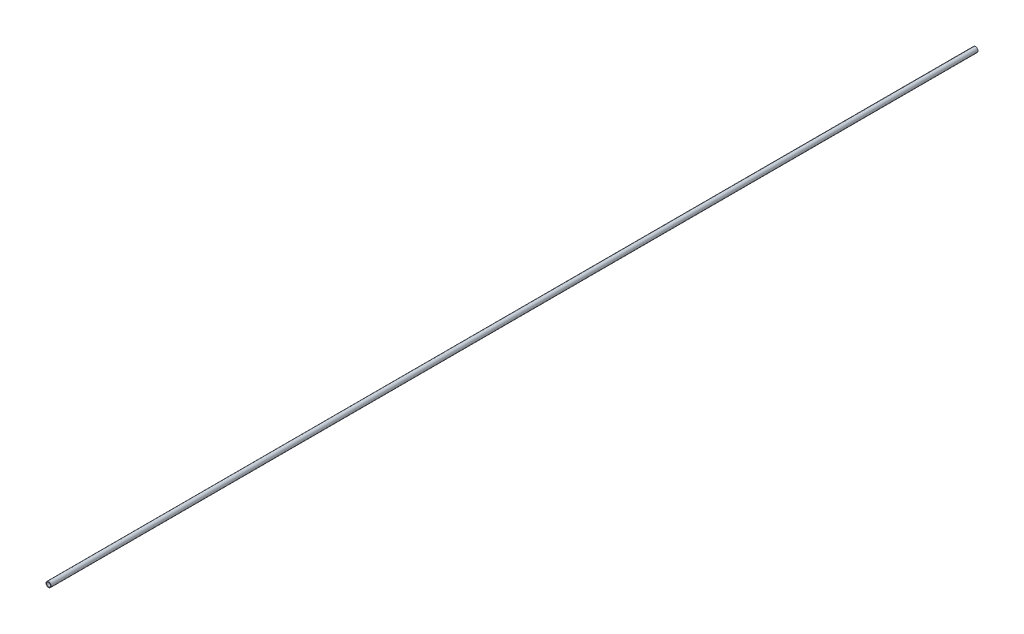
ISO-10303-21;
HEADER;
FILE_DESCRIPTION(('STEP AP214'),'2;1');
FILE_NAME('part.step','',(''),(''),'','','');
FILE_SCHEMA(('AUTOMOTIVE_DESIGN { 1 0 10303 214 1 1 1 1 }'));
ENDSEC;
DATA;
#1=APPLICATION_CONTEXT('core data for automotive mechanical design processes');
#2=APPLICATION_PROTOCOL_DEFINITION('international standard','automotive_design',2000,#1);
#3=PRODUCT_CONTEXT('',#1,'mechanical');
#4=PRODUCT('Part','Part','',(#3));
#5=PRODUCT_RELATED_PRODUCT_CATEGORY('part','',(#4));
#6=PRODUCT_DEFINITION_FORMATION('','',#4);
#7=PRODUCT_DEFINITION_CONTEXT('part definition',#1,'design');
#8=PRODUCT_DEFINITION('design','',#6,#7);
#9=PRODUCT_DEFINITION_SHAPE('','',#8);
#10=(LENGTH_UNIT() NAMED_UNIT(*) SI_UNIT(.MILLI.,.METRE.));
#11=(NAMED_UNIT(*) PLANE_ANGLE_UNIT() SI_UNIT($,.RADIAN.));
#12=(NAMED_UNIT(*) SI_UNIT($,.STERADIAN.) SOLID_ANGLE_UNIT());
#13=UNCERTAINTY_MEASURE_WITH_UNIT(LENGTH_MEASURE(1.E-05),#10,'distance_accuracy_value','');
#14=(GEOMETRIC_REPRESENTATION_CONTEXT(3) GLOBAL_UNCERTAINTY_ASSIGNED_CONTEXT((#13)) GLOBAL_UNIT_ASSIGNED_CONTEXT((#10,
#11,#12)) REPRESENTATION_CONTEXT('',''));
#15=CARTESIAN_POINT('',(0.,0.,0.));
#16=DIRECTION('',(0.,0.,1.));
#17=DIRECTION('',(1.,0.,0.));
#18=AXIS2_PLACEMENT_3D('',#15,#16,#17);
#19=CARTESIAN_POINT('',(0.,0.,3048.));
#20=DIRECTION('',(0.,0.,1.));
#21=DIRECTION('',(1.,0.,0.));
#22=AXIS2_PLACEMENT_3D('',#19,#20,#21);
#23=PLANE('',#22);
#24=CARTESIAN_POINT('',(0.,0.,3048.));
#25=DIRECTION('',(0.,0.,1.));
#26=DIRECTION('',(1.,0.,0.));
#27=AXIS2_PLACEMENT_3D('',#24,#25,#26);
#28=CIRCLE('',#27,16.7005);
#29=CARTESIAN_POINT('',(16.7005,0.,3048.));
#30=VERTEX_POINT('',#29);
#31=EDGE_CURVE('E10',#30,#30,#28,.T.);
#32=ORIENTED_EDGE('',*,*,#31,.T.);
#33=EDGE_LOOP('',(#32));
#34=FACE_BOUND('',#33,.T.);
#35=CARTESIAN_POINT('',(0.,0.,3048.));
#36=DIRECTION('',(0.,0.,1.));
#37=DIRECTION('',(1.,0.,0.));
#38=AXIS2_PLACEMENT_3D('',#35,#36,#37);
#39=CIRCLE('',#38,13.3223);
#40=CARTESIAN_POINT('',(13.3223,0.,3048.));
#41=VERTEX_POINT('',#40);
#42=EDGE_CURVE('E42',#41,#41,#39,.T.);
#43=ORIENTED_EDGE('',*,*,#42,.F.);
#44=EDGE_LOOP('',(#43));
#45=FACE_BOUND('',#44,.T.);
#46=ADVANCED_FACE('F31',(#34,#45),#23,.T.);
#47=CARTESIAN_POINT('',(0.,0.,-3048.));
#48=DIRECTION('',(0.,0.,1.));
#49=DIRECTION('',(1.,0.,0.));
#50=AXIS2_PLACEMENT_3D('',#47,#48,#49);
#51=PLANE('',#50);
#52=CARTESIAN_POINT('',(0.,0.,-3048.));
#53=DIRECTION('',(0.,0.,1.));
#54=DIRECTION('',(1.,0.,0.));
#55=AXIS2_PLACEMENT_3D('',#52,#53,#54);
#56=CIRCLE('',#55,16.7005);
#57=CARTESIAN_POINT('',(16.7005,0.,-3048.));
#58=VERTEX_POINT('',#57);
#59=EDGE_CURVE('E35',#58,#58,#56,.T.);
#60=ORIENTED_EDGE('',*,*,#59,.F.);
#61=EDGE_LOOP('',(#60));
#62=FACE_BOUND('',#61,.T.);
#63=CARTESIAN_POINT('',(0.,0.,-3048.));
#64=DIRECTION('',(0.,0.,1.));
#65=DIRECTION('',(1.,0.,0.));
#66=AXIS2_PLACEMENT_3D('',#63,#64,#65);
#67=CIRCLE('',#66,13.3223);
#68=CARTESIAN_POINT('',(13.3223,0.,-3048.));
#69=VERTEX_POINT('',#68);
#70=EDGE_CURVE('E44',#69,#69,#67,.T.);
#71=ORIENTED_EDGE('',*,*,#70,.T.);
#72=EDGE_LOOP('',(#71));
#73=FACE_BOUND('',#72,.T.);
#74=ADVANCED_FACE('F54',(#62,#73),#51,.F.);
#75=CARTESIAN_POINT('',(0.,0.,3048.));
#76=DIRECTION('',(0.,0.,-1.));
#77=DIRECTION('',(-1.,0.,0.));
#78=AXIS2_PLACEMENT_3D('',#75,#76,#77);
#79=CYLINDRICAL_SURFACE('',#78,16.7005);
#80=ORIENTED_EDGE('',*,*,#31,.F.);
#81=EDGE_LOOP('',(#80));
#82=FACE_BOUND('',#81,.T.);
#83=ORIENTED_EDGE('',*,*,#59,.T.);
#84=EDGE_LOOP('',(#83));
#85=FACE_BOUND('',#84,.T.);
#86=ADVANCED_FACE('F33',(#82,#85),#79,.T.);
#87=CARTESIAN_POINT('',(0.,0.,3048.));
#88=DIRECTION('',(0.,0.,-1.));
#89=DIRECTION('',(-1.,0.,0.));
#90=AXIS2_PLACEMENT_3D('',#87,#88,#89);
#91=CYLINDRICAL_SURFACE('',#90,13.3223);
#92=ORIENTED_EDGE('',*,*,#42,.T.);
#93=EDGE_LOOP('',(#92));
#94=FACE_BOUND('',#93,.T.);
#95=ORIENTED_EDGE('',*,*,#70,.F.);
#96=EDGE_LOOP('',(#95));
#97=FACE_BOUND('',#96,.T.);
#98=ADVANCED_FACE('F50',(#94,#97),#91,.F.);
#99=CLOSED_SHELL('',(#46,#74,#86,#98));
#100=MANIFOLD_SOLID_BREP('B2',#99);
#101=ADVANCED_BREP_SHAPE_REPRESENTATION('',(#18,#100),#14);
#102=SHAPE_DEFINITION_REPRESENTATION(#9,#101);
ENDSEC;
END-ISO-10303-21;
